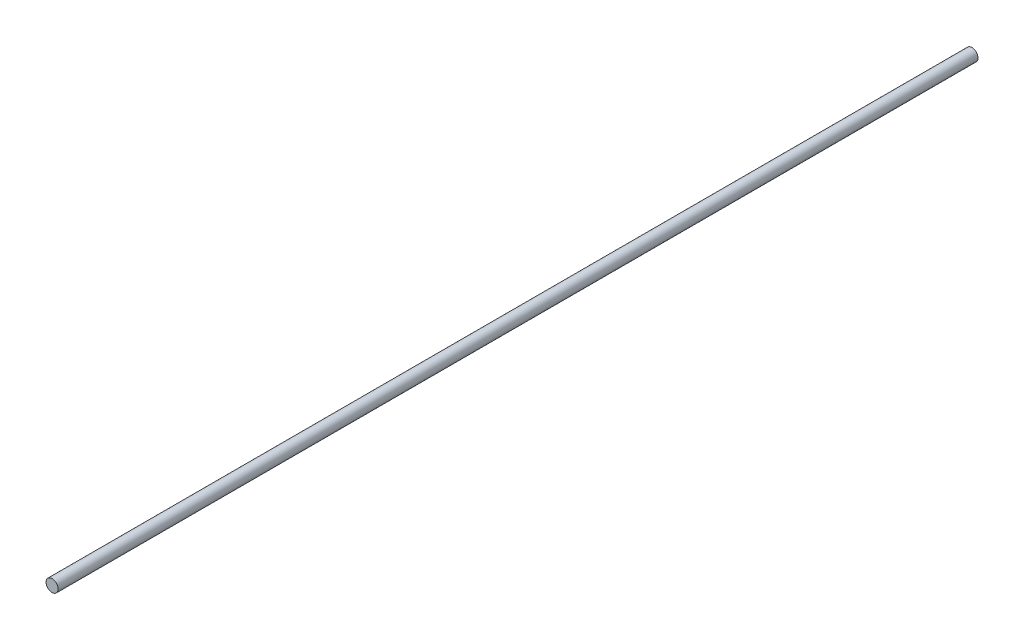
ISO-10303-21;
HEADER;
FILE_DESCRIPTION(('STEP AP214'),'2;1');
FILE_NAME('part.step','',(''),(''),'','','');
FILE_SCHEMA(('AUTOMOTIVE_DESIGN { 1 0 10303 214 1 1 1 1 }'));
ENDSEC;
DATA;
#1=APPLICATION_CONTEXT('core data for automotive mechanical design processes');
#2=APPLICATION_PROTOCOL_DEFINITION('international standard','automotive_design',2000,#1);
#3=PRODUCT_CONTEXT('',#1,'mechanical');
#4=PRODUCT('Part','Part','',(#3));
#5=PRODUCT_RELATED_PRODUCT_CATEGORY('part','',(#4));
#6=PRODUCT_DEFINITION_FORMATION('','',#4);
#7=PRODUCT_DEFINITION_CONTEXT('part definition',#1,'design');
#8=PRODUCT_DEFINITION('design','',#6,#7);
#9=PRODUCT_DEFINITION_SHAPE('','',#8);
#10=(LENGTH_UNIT() NAMED_UNIT(*) SI_UNIT(.MILLI.,.METRE.));
#11=(NAMED_UNIT(*) PLANE_ANGLE_UNIT() SI_UNIT($,.RADIAN.));
#12=(NAMED_UNIT(*) SI_UNIT($,.STERADIAN.) SOLID_ANGLE_UNIT());
#13=UNCERTAINTY_MEASURE_WITH_UNIT(LENGTH_MEASURE(1.E-05),#10,'distance_accuracy_value','');
#14=(GEOMETRIC_REPRESENTATION_CONTEXT(3) GLOBAL_UNCERTAINTY_ASSIGNED_CONTEXT((#13)) GLOBAL_UNIT_ASSIGNED_CONTEXT((#10,
#11,#12)) REPRESENTATION_CONTEXT('',''));
#15=CARTESIAN_POINT('',(0.,0.,0.));
#16=DIRECTION('',(0.,0.,1.));
#17=DIRECTION('',(1.,0.,0.));
#18=AXIS2_PLACEMENT_3D('',#15,#16,#17);
#19=CARTESIAN_POINT('',(0.,0.,482.6));
#20=DIRECTION('',(0.,0.,-1.));
#21=DIRECTION('',(-1.,0.,0.));
#22=AXIS2_PLACEMENT_3D('',#19,#20,#21);
#23=CYLINDRICAL_SURFACE('',#22,3.175);
#24=CARTESIAN_POINT('',(0.,0.,482.6));
#25=DIRECTION('',(0.,0.,1.));
#26=DIRECTION('',(1.,0.,0.));
#27=AXIS2_PLACEMENT_3D('',#24,#25,#26);
#28=CIRCLE('',#27,3.175);
#29=CARTESIAN_POINT('',(-3.175,0.,482.6));
#30=VERTEX_POINT('',#29);
#31=EDGE_CURVE('E10',#30,#30,#28,.T.);
#32=CARTESIAN_POINT('',(0.,0.,0.));
#33=DIRECTION('',(0.,0.,1.));
#34=DIRECTION('',(1.,0.,0.));
#35=AXIS2_PLACEMENT_3D('',#32,#33,#34);
#36=CIRCLE('',#35,3.175);
#37=CARTESIAN_POINT('',(-3.175,0.,0.));
#38=VERTEX_POINT('',#37);
#39=EDGE_CURVE('E35',#38,#38,#36,.T.);
#40=CARTESIAN_POINT('',(-3.175,0.,482.6));
#41=CARTESIAN_POINT('',(-3.175,0.,477.572916666667));
#42=CARTESIAN_POINT('',(-3.175,0.,472.545833333333));
#43=CARTESIAN_POINT('',(-3.175,0.,462.491666666667));
#44=CARTESIAN_POINT('',(-3.175,0.,457.464583333333));
#45=CARTESIAN_POINT('',(-3.175,0.,447.410416666667));
#46=CARTESIAN_POINT('',(-3.175,0.,442.383333333333));
#47=CARTESIAN_POINT('',(-3.175,0.,432.329166666667));
#48=CARTESIAN_POINT('',(-3.175,0.,427.302083333333));
#49=CARTESIAN_POINT('',(-3.175,0.,417.247916666667));
#50=CARTESIAN_POINT('',(-3.175,0.,412.220833333333));
#51=CARTESIAN_POINT('',(-3.175,0.,402.166666666667));
#52=CARTESIAN_POINT('',(-3.175,0.,397.139583333333));
#53=CARTESIAN_POINT('',(-3.175,0.,387.085416666667));
#54=CARTESIAN_POINT('',(-3.175,0.,382.058333333333));
#55=CARTESIAN_POINT('',(-3.175,0.,372.004166666667));
#56=CARTESIAN_POINT('',(-3.175,0.,366.977083333333));
#57=CARTESIAN_POINT('',(-3.175,0.,356.922916666667));
#58=CARTESIAN_POINT('',(-3.175,0.,351.895833333333));
#59=CARTESIAN_POINT('',(-3.175,0.,341.841666666667));
#60=CARTESIAN_POINT('',(-3.175,0.,336.814583333333));
#61=CARTESIAN_POINT('',(-3.175,0.,326.760416666667));
#62=CARTESIAN_POINT('',(-3.175,0.,321.733333333333));
#63=CARTESIAN_POINT('',(-3.175,0.,311.679166666667));
#64=CARTESIAN_POINT('',(-3.175,0.,306.652083333333));
#65=CARTESIAN_POINT('',(-3.175,0.,296.597916666667));
#66=CARTESIAN_POINT('',(-3.175,0.,291.570833333333));
#67=CARTESIAN_POINT('',(-3.175,0.,281.516666666667));
#68=CARTESIAN_POINT('',(-3.175,0.,276.489583333333));
#69=CARTESIAN_POINT('',(-3.175,0.,266.435416666667));
#70=CARTESIAN_POINT('',(-3.175,0.,261.408333333333));
#71=CARTESIAN_POINT('',(-3.175,0.,251.354166666667));
#72=CARTESIAN_POINT('',(-3.175,0.,246.327083333333));
#73=CARTESIAN_POINT('',(-3.175,0.,236.272916666667));
#74=CARTESIAN_POINT('',(-3.175,0.,231.245833333333));
#75=CARTESIAN_POINT('',(-3.175,0.,221.191666666667));
#76=CARTESIAN_POINT('',(-3.175,0.,216.164583333333));
#77=CARTESIAN_POINT('',(-3.175,0.,206.110416666667));
#78=CARTESIAN_POINT('',(-3.175,0.,201.083333333333));
#79=CARTESIAN_POINT('',(-3.175,0.,191.029166666667));
#80=CARTESIAN_POINT('',(-3.175,0.,186.002083333333));
#81=CARTESIAN_POINT('',(-3.175,0.,175.947916666667));
#82=CARTESIAN_POINT('',(-3.175,0.,170.920833333333));
#83=CARTESIAN_POINT('',(-3.175,0.,160.866666666667));
#84=CARTESIAN_POINT('',(-3.175,0.,155.839583333333));
#85=CARTESIAN_POINT('',(-3.175,0.,145.785416666667));
#86=CARTESIAN_POINT('',(-3.175,0.,140.758333333333));
#87=CARTESIAN_POINT('',(-3.175,0.,130.704166666667));
#88=CARTESIAN_POINT('',(-3.175,0.,125.677083333333));
#89=CARTESIAN_POINT('',(-3.175,0.,115.622916666667));
#90=CARTESIAN_POINT('',(-3.175,0.,110.595833333333));
#91=CARTESIAN_POINT('',(-3.175,0.,100.541666666667));
#92=CARTESIAN_POINT('',(-3.175,0.,95.5145833333333));
#93=CARTESIAN_POINT('',(-3.175,0.,85.4604166666667));
#94=CARTESIAN_POINT('',(-3.175,0.,80.4333333333333));
#95=CARTESIAN_POINT('',(-3.175,0.,70.3791666666667));
#96=CARTESIAN_POINT('',(-3.175,0.,65.3520833333334));
#97=CARTESIAN_POINT('',(-3.175,0.,55.2979166666667));
#98=CARTESIAN_POINT('',(-3.175,0.,50.2708333333334));
#99=CARTESIAN_POINT('',(-3.175,0.,40.2166666666667));
#100=CARTESIAN_POINT('',(-3.175,0.,35.1895833333333));
#101=CARTESIAN_POINT('',(-3.175,0.,25.1354166666667));
#102=CARTESIAN_POINT('',(-3.175,0.,20.1083333333333));
#103=CARTESIAN_POINT('',(-3.175,0.,10.0541666666667));
#104=CARTESIAN_POINT('',(-3.175,0.,5.02708333333333));
#105=CARTESIAN_POINT('',(-3.175,0.,0.));
#106=B_SPLINE_CURVE_WITH_KNOTS('',3,(#40,#41,#42,#43,#44,#45,#46,#47,#48,#49,#50,#51,#52,#53,
#54,#55,#56,#57,#58,#59,#60,#61,#62,#63,#64,#65,#66,#67,#68,#69,#70,#71,#72,#73,#74,#75,#76,#77,
#78,#79,#80,#81,#82,#83,#84,#85,#86,#87,#88,#89,#90,#91,#92,#93,#94,#95,#96,#97,#98,#99,#100,
#101,#102,#103,#104,#105),.UNSPECIFIED.,.F.,.F.,(4,2,2,2,2,2,2,2,2,2,2,2,2,2,2,2,2,2,2,2,2,2,2,
2,2,2,2,2,2,2,2,2,4),(0.,15.08125,30.1625,45.24375,60.325,75.40625,90.4875,105.56875,120.65,
135.73125,150.8125,165.89375,180.975,196.05625,211.1375,226.21875,241.3,256.38125,271.4625,
286.54375,301.625,316.70625,331.7875,346.86875,361.95,377.03125,392.1125,407.19375,422.275,
437.35625,452.4375,467.51875,482.6),.UNSPECIFIED.);
#107=EDGE_CURVE('BSEAM32',#30,#38,#106,.T.);
#108=ORIENTED_EDGE('',*,*,#31,.F.);
#109=ORIENTED_EDGE('',*,*,#39,.T.);
#110=ORIENTED_EDGE('',*,*,#107,.T.);
#111=ORIENTED_EDGE('',*,*,#107,.F.);
#112=EDGE_LOOP('',(#108,#110,#109,#111));
#113=FACE_BOUND('',#112,.T.);
#114=ADVANCED_FACE('F32',(#113),#23,.T.);
#115=CARTESIAN_POINT('',(0.,0.,482.6));
#116=DIRECTION('',(0.,0.,1.));
#117=DIRECTION('',(1.,0.,0.));
#118=AXIS2_PLACEMENT_3D('',#115,#116,#117);
#119=PLANE('',#118);
#120=ORIENTED_EDGE('',*,*,#31,.T.);
#121=EDGE_LOOP('',(#120));
#122=FACE_BOUND('',#121,.T.);
#123=ADVANCED_FACE('F47',(#122),#119,.T.);
#124=CARTESIAN_POINT('',(0.,0.,0.));
#125=DIRECTION('',(0.,0.,1.));
#126=DIRECTION('',(1.,0.,0.));
#127=AXIS2_PLACEMENT_3D('',#124,#125,#126);
#128=PLANE('',#127);
#129=ORIENTED_EDGE('',*,*,#39,.F.);
#130=EDGE_LOOP('',(#129));
#131=FACE_BOUND('',#130,.T.);
#132=ADVANCED_FACE('F45',(#131),#128,.F.);
#133=CLOSED_SHELL('',(#114,#123,#132));
#134=MANIFOLD_SOLID_BREP('B2',#133);
#135=ADVANCED_BREP_SHAPE_REPRESENTATION('',(#18,#134),#14);
#136=SHAPE_DEFINITION_REPRESENTATION(#9,#135);
ENDSEC;
END-ISO-10303-21;
